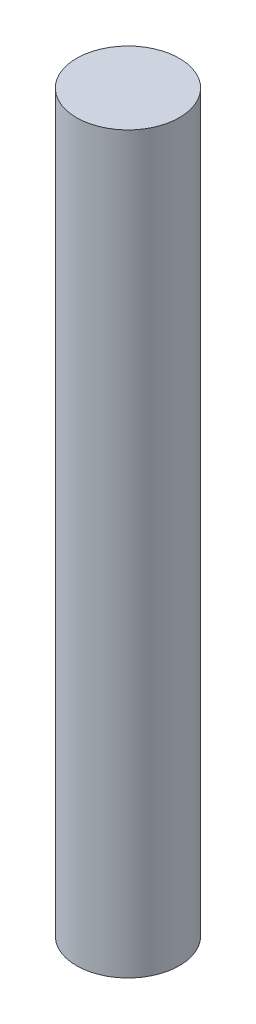
ISO-10303-21;
HEADER;
FILE_DESCRIPTION(('STEP AP214'),'2;1');
FILE_NAME('part.step','',(''),(''),'','','');
FILE_SCHEMA(('AUTOMOTIVE_DESIGN { 1 0 10303 214 1 1 1 1 }'));
ENDSEC;
DATA;
#1=APPLICATION_CONTEXT('core data for automotive mechanical design processes');
#2=APPLICATION_PROTOCOL_DEFINITION('international standard','automotive_design',2000,#1);
#3=PRODUCT_CONTEXT('',#1,'mechanical');
#4=PRODUCT('Part','Part','',(#3));
#5=PRODUCT_RELATED_PRODUCT_CATEGORY('part','',(#4));
#6=PRODUCT_DEFINITION_FORMATION('','',#4);
#7=PRODUCT_DEFINITION_CONTEXT('part definition',#1,'design');
#8=PRODUCT_DEFINITION('design','',#6,#7);
#9=PRODUCT_DEFINITION_SHAPE('','',#8);
#10=(LENGTH_UNIT() NAMED_UNIT(*) SI_UNIT(.MILLI.,.METRE.));
#11=(NAMED_UNIT(*) PLANE_ANGLE_UNIT() SI_UNIT($,.RADIAN.));
#12=(NAMED_UNIT(*) SI_UNIT($,.STERADIAN.) SOLID_ANGLE_UNIT());
#13=UNCERTAINTY_MEASURE_WITH_UNIT(LENGTH_MEASURE(1.E-05),#10,'distance_accuracy_value','');
#14=(GEOMETRIC_REPRESENTATION_CONTEXT(3) GLOBAL_UNCERTAINTY_ASSIGNED_CONTEXT((#13)) GLOBAL_UNIT_ASSIGNED_CONTEXT((#10,
#11,#12)) REPRESENTATION_CONTEXT('',''));
#15=CARTESIAN_POINT('',(0.,0.,0.));
#16=DIRECTION('',(0.,0.,1.));
#17=DIRECTION('',(1.,0.,0.));
#18=AXIS2_PLACEMENT_3D('',#15,#16,#17);
#19=CARTESIAN_POINT('',(0.,500.,0.));
#20=DIRECTION('',(0.,-1.,0.));
#21=DIRECTION('',(0.,0.,-1.00000000000001));
#22=AXIS2_PLACEMENT_3D('',#19,#20,#21);
#23=CYLINDRICAL_SURFACE('',#22,35.);
#24=CARTESIAN_POINT('',(0.,500.,0.));
#25=DIRECTION('',(0.,1.,0.));
#26=DIRECTION('',(0.,0.,1.00000000000001));
#27=AXIS2_PLACEMENT_3D('',#24,#25,#26);
#28=CIRCLE('',#27,35.);
#29=CARTESIAN_POINT('',(0.,500.,35.0000000000003));
#30=VERTEX_POINT('',#29);
#31=EDGE_CURVE('E10',#30,#30,#28,.T.);
#32=ORIENTED_EDGE('',*,*,#31,.F.);
#33=EDGE_LOOP('',(#32));
#34=FACE_BOUND('',#33,.T.);
#35=CARTESIAN_POINT('',(0.,0.,0.));
#36=DIRECTION('',(0.,1.,0.));
#37=DIRECTION('',(0.,0.,1.00000000000001));
#38=AXIS2_PLACEMENT_3D('',#35,#36,#37);
#39=CIRCLE('',#38,35.);
#40=CARTESIAN_POINT('',(0.,0.,35.0000000000003));
#41=VERTEX_POINT('',#40);
#42=EDGE_CURVE('E46',#41,#41,#39,.T.);
#43=ORIENTED_EDGE('',*,*,#42,.T.);
#44=EDGE_LOOP('',(#43));
#45=FACE_BOUND('',#44,.T.);
#46=ADVANCED_FACE('F43',(#34,#45),#23,.T.);
#47=CARTESIAN_POINT('',(0.,500.,0.));
#48=DIRECTION('',(0.,1.,0.));
#49=DIRECTION('',(0.,0.,1.00000000000001));
#50=AXIS2_PLACEMENT_3D('',#47,#48,#49);
#51=PLANE('',#50);
#52=ORIENTED_EDGE('',*,*,#31,.T.);
#53=EDGE_LOOP('',(#52));
#54=FACE_BOUND('',#53,.T.);
#55=ADVANCED_FACE('F62',(#54),#51,.T.);
#56=CARTESIAN_POINT('',(0.,0.,0.));
#57=DIRECTION('',(0.,1.,0.));
#58=DIRECTION('',(0.,0.,1.00000000000001));
#59=AXIS2_PLACEMENT_3D('',#56,#57,#58);
#60=PLANE('',#59);
#61=ORIENTED_EDGE('',*,*,#42,.F.);
#62=EDGE_LOOP('',(#61));
#63=FACE_BOUND('',#62,.T.);
#64=ADVANCED_FACE('F60',(#63),#60,.F.);
#65=CLOSED_SHELL('',(#46,#55,#64));
#66=MANIFOLD_SOLID_BREP('B2',#65);
#67=ADVANCED_BREP_SHAPE_REPRESENTATION('',(#18,#66),#14);
#68=SHAPE_DEFINITION_REPRESENTATION(#9,#67);
ENDSEC;
END-ISO-10303-21;
